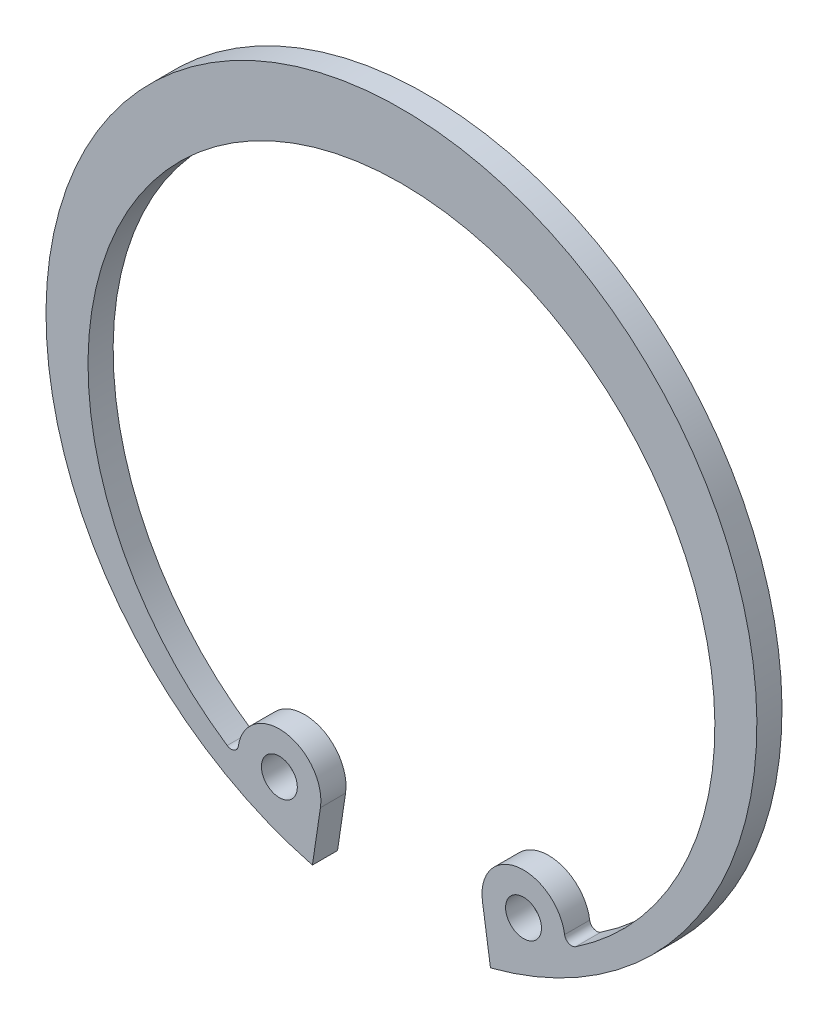
ISO-10303-21;
HEADER;
FILE_DESCRIPTION(('STEP AP214'),'2;1');
FILE_NAME('part.step','',(''),(''),'','','');
FILE_SCHEMA(('AUTOMOTIVE_DESIGN { 1 0 10303 214 1 1 1 1 }'));
ENDSEC;
DATA;
#1=APPLICATION_CONTEXT('core data for automotive mechanical design processes');
#2=APPLICATION_PROTOCOL_DEFINITION('international standard','automotive_design',2000,#1);
#3=PRODUCT_CONTEXT('',#1,'mechanical');
#4=PRODUCT('Part','Part','',(#3));
#5=PRODUCT_RELATED_PRODUCT_CATEGORY('part','',(#4));
#6=PRODUCT_DEFINITION_FORMATION('','',#4);
#7=PRODUCT_DEFINITION_CONTEXT('part definition',#1,'design');
#8=PRODUCT_DEFINITION('design','',#6,#7);
#9=PRODUCT_DEFINITION_SHAPE('','',#8);
#10=(LENGTH_UNIT() NAMED_UNIT(*) SI_UNIT(.MILLI.,.METRE.));
#11=(NAMED_UNIT(*) PLANE_ANGLE_UNIT() SI_UNIT($,.RADIAN.));
#12=(NAMED_UNIT(*) SI_UNIT($,.STERADIAN.) SOLID_ANGLE_UNIT());
#13=UNCERTAINTY_MEASURE_WITH_UNIT(LENGTH_MEASURE(1.E-05),#10,'distance_accuracy_value','');
#14=(GEOMETRIC_REPRESENTATION_CONTEXT(3) GLOBAL_UNCERTAINTY_ASSIGNED_CONTEXT((#13)) GLOBAL_UNIT_ASSIGNED_CONTEXT((#10,
#11,#12)) REPRESENTATION_CONTEXT('',''));
#15=CARTESIAN_POINT('',(0.,0.,0.));
#16=DIRECTION('',(0.,0.,1.));
#17=DIRECTION('',(1.,0.,0.));
#18=AXIS2_PLACEMENT_3D('',#15,#16,#17);
#19=CARTESIAN_POINT('',(-8.5,-19.7928377926956,1.75));
#20=DIRECTION('',(0.,0.,1.));
#21=DIRECTION('',(1.,0.,0.));
#22=AXIS2_PLACEMENT_3D('',#19,#20,#21);
#23=PLANE('',#22);
#24=CARTESIAN_POINT('',(-8.5,-19.7928377926956,1.75));
#25=DIRECTION('',(0.,0.,1.));
#26=DIRECTION('',(1.,0.,0.));
#27=AXIS2_PLACEMENT_3D('',#24,#25,#26);
#28=CIRCLE('',#27,1.25);
#29=CARTESIAN_POINT('',(-7.25,-19.7928377926956,1.75));
#30=VERTEX_POINT('',#29);
#31=EDGE_CURVE('E134',#30,#30,#28,.T.);
#32=ORIENTED_EDGE('',*,*,#31,.F.);
#33=EDGE_LOOP('',(#32));
#34=FACE_BOUND('',#33,.T.);
#35=CARTESIAN_POINT('',(-8.5,-19.7928377926956,1.75));
#36=DIRECTION('',(0.,0.,1.));
#37=DIRECTION('',(1.,0.,0.));
#38=AXIS2_PLACEMENT_3D('',#35,#36,#37);
#39=CIRCLE('',#38,2.89080843162481);
#40=CARTESIAN_POINT('',(-5.64094460318268,-20.2201264846626,1.75));
#41=VERTEX_POINT('',#40);
#42=CARTESIAN_POINT('',(-11.3602513121852,-19.3736292294532,1.75));
#43=VERTEX_POINT('',#42);
#44=EDGE_CURVE('E145',#41,#43,#39,.T.);
#45=ORIENTED_EDGE('',*,*,#44,.T.);
#46=CARTESIAN_POINT('',(-11.8549660917768,-19.3011220790906,1.75));
#47=DIRECTION('',(0.,0.,-1.));
#48=DIRECTION('',(1.,0.,0.));
#49=AXIS2_PLACEMENT_3D('',#46,#47,#48);
#50=CIRCLE('',#49,0.500000000000003);
#51=CARTESIAN_POINT('',(-12.1329254374222,-19.7167404162322,1.75));
#52=VERTEX_POINT('',#51);
#53=EDGE_CURVE('E93',#43,#52,#50,.T.);
#54=ORIENTED_EDGE('',*,*,#53,.T.);
#55=CARTESIAN_POINT('',(0.,-1.575,1.75));
#56=DIRECTION('',(0.,0.,-1.));
#57=DIRECTION('',(1.,0.,0.));
#58=AXIS2_PLACEMENT_3D('',#55,#56,#57);
#59=CIRCLE('',#58,21.825);
#60=CARTESIAN_POINT('',(12.1329254374222,-19.7167404162322,1.75));
#61=VERTEX_POINT('',#60);
#62=EDGE_CURVE('E160',#52,#61,#59,.T.);
#63=ORIENTED_EDGE('',*,*,#62,.T.);
#64=CARTESIAN_POINT('',(11.8549660917768,-19.3011220790906,1.75));
#65=DIRECTION('',(0.,0.,-1.));
#66=DIRECTION('',(-1.,0.,0.));
#67=AXIS2_PLACEMENT_3D('',#64,#65,#66);
#68=CIRCLE('',#67,0.500000000000003);
#69=CARTESIAN_POINT('',(11.3602513121852,-19.3736292294532,1.75));
#70=VERTEX_POINT('',#69);
#71=EDGE_CURVE('E173',#61,#70,#68,.T.);
#72=ORIENTED_EDGE('',*,*,#71,.T.);
#73=CARTESIAN_POINT('',(8.5,-19.7928377926956,1.75));
#74=DIRECTION('',(0.,0.,1.));
#75=DIRECTION('',(1.,0.,0.));
#76=AXIS2_PLACEMENT_3D('',#73,#74,#75);
#77=CIRCLE('',#76,2.89080843162481);
#78=CARTESIAN_POINT('',(5.64094460318268,-20.2201264846626,1.75));
#79=VERTEX_POINT('',#78);
#80=EDGE_CURVE('E112',#70,#79,#77,.T.);
#81=ORIENTED_EDGE('',*,*,#80,.T.);
#82=DIRECTION('',(0.147809411129611,-0.989015863361917,0.));
#83=VECTOR('',#82,1.);
#84=CARTESIAN_POINT('',(5.64094460318268,-20.2201264846626,1.75));
#85=LINE('',#84,#83);
#86=CARTESIAN_POINT('',(6.19999999999999,-23.9608534906418,1.75));
#87=VERTEX_POINT('',#86);
#88=EDGE_CURVE('E106',#79,#87,#85,.T.);
#89=ORIENTED_EDGE('',*,*,#88,.T.);
#90=CARTESIAN_POINT('',(0.,0.,1.75));
#91=DIRECTION('',(0.,0.,1.));
#92=DIRECTION('',(1.,0.,0.));
#93=AXIS2_PLACEMENT_3D('',#90,#91,#92);
#94=CIRCLE('',#93,24.75);
#95=CARTESIAN_POINT('',(-6.2,-23.9608534906418,1.75));
#96=VERTEX_POINT('',#95);
#97=EDGE_CURVE('E110',#87,#96,#94,.T.);
#98=ORIENTED_EDGE('',*,*,#97,.T.);
#99=DIRECTION('',(0.147809411129611,0.989015863361917,0.));
#100=VECTOR('',#99,1.);
#101=CARTESIAN_POINT('',(-5.64094460318268,-20.2201264846626,1.75));
#102=LINE('',#101,#100);
#103=EDGE_CURVE('E50',#96,#41,#102,.T.);
#104=ORIENTED_EDGE('',*,*,#103,.T.);
#105=EDGE_LOOP('',(#45,#54,#63,#72,#81,#89,#98,#104));
#106=FACE_BOUND('',#105,.T.);
#107=CARTESIAN_POINT('',(8.5,-19.7928377926956,1.75));
#108=DIRECTION('',(0.,0.,1.));
#109=DIRECTION('',(1.,0.,0.));
#110=AXIS2_PLACEMENT_3D('',#107,#108,#109);
#111=CIRCLE('',#110,1.25);
#112=CARTESIAN_POINT('',(9.75,-19.7928377926956,1.75));
#113=VERTEX_POINT('',#112);
#114=EDGE_CURVE('E182',#113,#113,#111,.T.);
#115=ORIENTED_EDGE('',*,*,#114,.F.);
#116=EDGE_LOOP('',(#115));
#117=FACE_BOUND('',#116,.T.);
#118=ADVANCED_FACE('F33',(#34,#106,#117),#23,.T.);
#119=CARTESIAN_POINT('',(-8.5,-19.7928377926956,0.));
#120=DIRECTION('',(0.,0.,1.));
#121=DIRECTION('',(1.,0.,0.));
#122=AXIS2_PLACEMENT_3D('',#119,#120,#121);
#123=PLANE('',#122);
#124=CARTESIAN_POINT('',(-8.5,-19.7928377926956,0.));
#125=DIRECTION('',(0.,0.,1.));
#126=DIRECTION('',(1.,0.,0.));
#127=AXIS2_PLACEMENT_3D('',#124,#125,#126);
#128=CIRCLE('',#127,2.89080843162481);
#129=CARTESIAN_POINT('',(-5.64094460318268,-20.2201264846626,0.));
#130=VERTEX_POINT('',#129);
#131=CARTESIAN_POINT('',(-11.3602513121852,-19.3736292294532,0.));
#132=VERTEX_POINT('',#131);
#133=EDGE_CURVE('E130',#130,#132,#128,.T.);
#134=ORIENTED_EDGE('',*,*,#133,.F.);
#135=DIRECTION('',(0.147809411129611,0.989015863361917,0.));
#136=VECTOR('',#135,1.);
#137=CARTESIAN_POINT('',(-5.64094460318268,-20.2201264846626,0.));
#138=LINE('',#137,#136);
#139=CARTESIAN_POINT('',(-6.2,-23.9608534906418,0.));
#140=VERTEX_POINT('',#139);
#141=EDGE_CURVE('E85',#140,#130,#138,.T.);
#142=ORIENTED_EDGE('',*,*,#141,.F.);
#143=CARTESIAN_POINT('',(0.,0.,0.));
#144=DIRECTION('',(0.,0.,1.));
#145=DIRECTION('',(1.,0.,0.));
#146=AXIS2_PLACEMENT_3D('',#143,#144,#145);
#147=CIRCLE('',#146,24.75);
#148=CARTESIAN_POINT('',(6.19999999999999,-23.9608534906418,0.));
#149=VERTEX_POINT('',#148);
#150=EDGE_CURVE('E79',#149,#140,#147,.T.);
#151=ORIENTED_EDGE('',*,*,#150,.F.);
#152=DIRECTION('',(0.147809411129611,-0.989015863361917,0.));
#153=VECTOR('',#152,1.);
#154=CARTESIAN_POINT('',(5.64094460318268,-20.2201264846626,0.));
#155=LINE('',#154,#153);
#156=CARTESIAN_POINT('',(5.64094460318268,-20.2201264846626,0.));
#157=VERTEX_POINT('',#156);
#158=EDGE_CURVE('E120',#157,#149,#155,.T.);
#159=ORIENTED_EDGE('',*,*,#158,.F.);
#160=CARTESIAN_POINT('',(8.5,-19.7928377926956,0.));
#161=DIRECTION('',(0.,0.,1.));
#162=DIRECTION('',(1.,0.,0.));
#163=AXIS2_PLACEMENT_3D('',#160,#161,#162);
#164=CIRCLE('',#163,2.89080843162481);
#165=CARTESIAN_POINT('',(11.3602513121852,-19.3736292294532,0.));
#166=VERTEX_POINT('',#165);
#167=EDGE_CURVE('E140',#166,#157,#164,.T.);
#168=ORIENTED_EDGE('',*,*,#167,.F.);
#169=CARTESIAN_POINT('',(11.8549660917768,-19.3011220790906,0.));
#170=DIRECTION('',(0.,0.,-1.));
#171=DIRECTION('',(-1.,0.,0.));
#172=AXIS2_PLACEMENT_3D('',#169,#170,#171);
#173=CIRCLE('',#172,0.500000000000003);
#174=CARTESIAN_POINT('',(12.1329254374222,-19.7167404162322,0.));
#175=VERTEX_POINT('',#174);
#176=EDGE_CURVE('E138',#175,#166,#173,.T.);
#177=ORIENTED_EDGE('',*,*,#176,.F.);
#178=CARTESIAN_POINT('',(0.,-1.575,0.));
#179=DIRECTION('',(0.,0.,-1.));
#180=DIRECTION('',(1.,0.,0.));
#181=AXIS2_PLACEMENT_3D('',#178,#179,#180);
#182=CIRCLE('',#181,21.825);
#183=CARTESIAN_POINT('',(-12.1329254374222,-19.7167404162322,0.));
#184=VERTEX_POINT('',#183);
#185=EDGE_CURVE('E136',#184,#175,#182,.T.);
#186=ORIENTED_EDGE('',*,*,#185,.F.);
#187=CARTESIAN_POINT('',(-11.8549660917768,-19.3011220790906,0.));
#188=DIRECTION('',(0.,0.,-1.));
#189=DIRECTION('',(1.,0.,0.));
#190=AXIS2_PLACEMENT_3D('',#187,#188,#189);
#191=CIRCLE('',#190,0.500000000000003);
#192=EDGE_CURVE('E133',#132,#184,#191,.T.);
#193=ORIENTED_EDGE('',*,*,#192,.F.);
#194=EDGE_LOOP('',(#134,#142,#151,#159,#168,#177,#186,#193));
#195=FACE_BOUND('',#194,.T.);
#196=CARTESIAN_POINT('',(-8.5,-19.7928377926956,0.));
#197=DIRECTION('',(0.,0.,1.));
#198=DIRECTION('',(1.,0.,0.));
#199=AXIS2_PLACEMENT_3D('',#196,#197,#198);
#200=CIRCLE('',#199,1.25);
#201=CARTESIAN_POINT('',(-7.25,-19.7928377926956,0.));
#202=VERTEX_POINT('',#201);
#203=EDGE_CURVE('E179',#202,#202,#200,.T.);
#204=ORIENTED_EDGE('',*,*,#203,.T.);
#205=EDGE_LOOP('',(#204));
#206=FACE_BOUND('',#205,.T.);
#207=CARTESIAN_POINT('',(8.5,-19.7928377926956,0.));
#208=DIRECTION('',(0.,0.,1.));
#209=DIRECTION('',(1.,0.,0.));
#210=AXIS2_PLACEMENT_3D('',#207,#208,#209);
#211=CIRCLE('',#210,1.25);
#212=CARTESIAN_POINT('',(9.75,-19.7928377926956,0.));
#213=VERTEX_POINT('',#212);
#214=EDGE_CURVE('E185',#213,#213,#211,.T.);
#215=ORIENTED_EDGE('',*,*,#214,.T.);
#216=EDGE_LOOP('',(#215));
#217=FACE_BOUND('',#216,.T.);
#218=ADVANCED_FACE('F164',(#195,#206,#217),#123,.F.);
#219=CARTESIAN_POINT('',(-8.5,-19.7928377926956,1.75));
#220=DIRECTION('',(0.,0.,-1.));
#221=DIRECTION('',(-1.,0.,0.));
#222=AXIS2_PLACEMENT_3D('',#219,#220,#221);
#223=CYLINDRICAL_SURFACE('',#222,2.89080843162481);
#224=ORIENTED_EDGE('',*,*,#133,.T.);
#225=DIRECTION('',(0.,0.,-1.));
#226=VECTOR('',#225,1.);
#227=CARTESIAN_POINT('',(-11.3602513121852,-19.3736292294532,1.75));
#228=LINE('',#227,#226);
#229=EDGE_CURVE('E11',#43,#132,#228,.T.);
#230=ORIENTED_EDGE('',*,*,#229,.F.);
#231=ORIENTED_EDGE('',*,*,#44,.F.);
#232=DIRECTION('',(0.,0.,-1.));
#233=VECTOR('',#232,1.);
#234=CARTESIAN_POINT('',(-5.64094460318268,-20.2201264846626,1.75));
#235=LINE('',#234,#233);
#236=EDGE_CURVE('E126',#41,#130,#235,.T.);
#237=ORIENTED_EDGE('',*,*,#236,.T.);
#238=EDGE_LOOP('',(#224,#230,#231,#237));
#239=FACE_BOUND('',#238,.T.);
#240=ADVANCED_FACE('F35',(#239),#223,.T.);
#241=CARTESIAN_POINT('',(-11.8549660917768,-19.3011220790906,1.75));
#242=DIRECTION('',(0.,0.,-1.));
#243=DIRECTION('',(-1.,0.,0.));
#244=AXIS2_PLACEMENT_3D('',#241,#242,#243);
#245=CYLINDRICAL_SURFACE('',#244,0.500000000000003);
#246=ORIENTED_EDGE('',*,*,#192,.T.);
#247=DIRECTION('',(0.,0.,-1.));
#248=VECTOR('',#247,1.);
#249=CARTESIAN_POINT('',(-12.1329254374222,-19.7167404162322,1.75));
#250=LINE('',#249,#248);
#251=EDGE_CURVE('E42',#52,#184,#250,.T.);
#252=ORIENTED_EDGE('',*,*,#251,.F.);
#253=ORIENTED_EDGE('',*,*,#53,.F.);
#254=ORIENTED_EDGE('',*,*,#229,.T.);
#255=EDGE_LOOP('',(#246,#252,#253,#254));
#256=FACE_BOUND('',#255,.T.);
#257=ADVANCED_FACE('F217',(#256),#245,.F.);
#258=CARTESIAN_POINT('',(0.,-1.575,1.75));
#259=DIRECTION('',(0.,0.,-1.));
#260=DIRECTION('',(-1.,0.,0.));
#261=AXIS2_PLACEMENT_3D('',#258,#259,#260);
#262=CYLINDRICAL_SURFACE('',#261,21.825);
#263=ORIENTED_EDGE('',*,*,#185,.T.);
#264=DIRECTION('',(0.,0.,-1.));
#265=VECTOR('',#264,1.);
#266=CARTESIAN_POINT('',(12.1329254374222,-19.7167404162322,1.75));
#267=LINE('',#266,#265);
#268=EDGE_CURVE('E152',#61,#175,#267,.T.);
#269=ORIENTED_EDGE('',*,*,#268,.F.);
#270=ORIENTED_EDGE('',*,*,#62,.F.);
#271=ORIENTED_EDGE('',*,*,#251,.T.);
#272=EDGE_LOOP('',(#263,#269,#270,#271));
#273=FACE_BOUND('',#272,.T.);
#274=ADVANCED_FACE('F158',(#273),#262,.F.);
#275=CARTESIAN_POINT('',(11.8549660917768,-19.3011220790906,1.75));
#276=DIRECTION('',(0.,0.,-1.));
#277=DIRECTION('',(-1.,0.,0.));
#278=AXIS2_PLACEMENT_3D('',#275,#276,#277);
#279=CYLINDRICAL_SURFACE('',#278,0.500000000000003);
#280=ORIENTED_EDGE('',*,*,#176,.T.);
#281=DIRECTION('',(0.,0.,-1.));
#282=VECTOR('',#281,1.);
#283=CARTESIAN_POINT('',(11.3602513121852,-19.3736292294532,1.75));
#284=LINE('',#283,#282);
#285=EDGE_CURVE('E149',#70,#166,#284,.T.);
#286=ORIENTED_EDGE('',*,*,#285,.F.);
#287=ORIENTED_EDGE('',*,*,#71,.F.);
#288=ORIENTED_EDGE('',*,*,#268,.T.);
#289=EDGE_LOOP('',(#280,#286,#287,#288));
#290=FACE_BOUND('',#289,.T.);
#291=ADVANCED_FACE('F169',(#290),#279,.F.);
#292=CARTESIAN_POINT('',(8.5,-19.7928377926956,1.75));
#293=DIRECTION('',(0.,0.,-1.));
#294=DIRECTION('',(-1.,0.,0.));
#295=AXIS2_PLACEMENT_3D('',#292,#293,#294);
#296=CYLINDRICAL_SURFACE('',#295,2.89080843162481);
#297=ORIENTED_EDGE('',*,*,#167,.T.);
#298=DIRECTION('',(0.,0.,-1.));
#299=VECTOR('',#298,1.);
#300=CARTESIAN_POINT('',(5.64094460318268,-20.2201264846626,1.75));
#301=LINE('',#300,#299);
#302=EDGE_CURVE('E121',#79,#157,#301,.T.);
#303=ORIENTED_EDGE('',*,*,#302,.F.);
#304=ORIENTED_EDGE('',*,*,#80,.F.);
#305=ORIENTED_EDGE('',*,*,#285,.T.);
#306=EDGE_LOOP('',(#297,#303,#304,#305));
#307=FACE_BOUND('',#306,.T.);
#308=ADVANCED_FACE('F172',(#307),#296,.T.);
#309=CARTESIAN_POINT('',(5.64094460318268,-20.2201264846626,1.75));
#310=DIRECTION('',(0.989015863361917,0.147809411129611,0.));
#311=DIRECTION('',(-0.147809411129611,0.989015863361917,0.));
#312=AXIS2_PLACEMENT_3D('',#309,#310,#311);
#313=PLANE('',#312);
#314=ORIENTED_EDGE('',*,*,#158,.T.);
#315=DIRECTION('',(0.,0.,-1.));
#316=VECTOR('',#315,1.);
#317=CARTESIAN_POINT('',(6.19999999999999,-23.9608534906418,1.75));
#318=LINE('',#317,#316);
#319=EDGE_CURVE('E117',#87,#149,#318,.T.);
#320=ORIENTED_EDGE('',*,*,#319,.F.);
#321=ORIENTED_EDGE('',*,*,#88,.F.);
#322=ORIENTED_EDGE('',*,*,#302,.T.);
#323=EDGE_LOOP('',(#314,#320,#321,#322));
#324=FACE_BOUND('',#323,.T.);
#325=ADVANCED_FACE('F118',(#324),#313,.F.);
#326=CARTESIAN_POINT('',(0.,0.,1.75));
#327=DIRECTION('',(0.,0.,-1.));
#328=DIRECTION('',(-1.,0.,0.));
#329=AXIS2_PLACEMENT_3D('',#326,#327,#328);
#330=CYLINDRICAL_SURFACE('',#329,24.75);
#331=ORIENTED_EDGE('',*,*,#150,.T.);
#332=DIRECTION('',(0.,0.,-1.));
#333=VECTOR('',#332,1.);
#334=CARTESIAN_POINT('',(-6.2,-23.9608534906418,1.75));
#335=LINE('',#334,#333);
#336=EDGE_CURVE('E122',#96,#140,#335,.T.);
#337=ORIENTED_EDGE('',*,*,#336,.F.);
#338=ORIENTED_EDGE('',*,*,#97,.F.);
#339=ORIENTED_EDGE('',*,*,#319,.T.);
#340=EDGE_LOOP('',(#331,#337,#338,#339));
#341=FACE_BOUND('',#340,.T.);
#342=ADVANCED_FACE('F124',(#341),#330,.T.);
#343=CARTESIAN_POINT('',(-5.64094460318268,-20.2201264846626,1.75));
#344=DIRECTION('',(-0.989015863361917,0.147809411129611,0.));
#345=DIRECTION('',(-0.147809411129611,-0.989015863361917,0.));
#346=AXIS2_PLACEMENT_3D('',#343,#344,#345);
#347=PLANE('',#346);
#348=ORIENTED_EDGE('',*,*,#141,.T.);
#349=ORIENTED_EDGE('',*,*,#236,.F.);
#350=ORIENTED_EDGE('',*,*,#103,.F.);
#351=ORIENTED_EDGE('',*,*,#336,.T.);
#352=EDGE_LOOP('',(#348,#349,#350,#351));
#353=FACE_BOUND('',#352,.T.);
#354=ADVANCED_FACE('F205',(#353),#347,.F.);
#355=CARTESIAN_POINT('',(-8.5,-19.7928377926956,1.75));
#356=DIRECTION('',(0.,0.,-1.));
#357=DIRECTION('',(-1.,0.,0.));
#358=AXIS2_PLACEMENT_3D('',#355,#356,#357);
#359=CYLINDRICAL_SURFACE('',#358,1.25);
#360=ORIENTED_EDGE('',*,*,#31,.T.);
#361=EDGE_LOOP('',(#360));
#362=FACE_BOUND('',#361,.T.);
#363=ORIENTED_EDGE('',*,*,#203,.F.);
#364=EDGE_LOOP('',(#363));
#365=FACE_BOUND('',#364,.T.);
#366=ADVANCED_FACE('F202',(#362,#365),#359,.F.);
#367=CARTESIAN_POINT('',(8.5,-19.7928377926956,1.75));
#368=DIRECTION('',(0.,0.,-1.));
#369=DIRECTION('',(-1.,0.,0.));
#370=AXIS2_PLACEMENT_3D('',#367,#368,#369);
#371=CYLINDRICAL_SURFACE('',#370,1.25);
#372=ORIENTED_EDGE('',*,*,#114,.T.);
#373=EDGE_LOOP('',(#372));
#374=FACE_BOUND('',#373,.T.);
#375=ORIENTED_EDGE('',*,*,#214,.F.);
#376=EDGE_LOOP('',(#375));
#377=FACE_BOUND('',#376,.T.);
#378=ADVANCED_FACE('F191',(#374,#377),#371,.F.);
#379=CLOSED_SHELL('',(#118,#218,#240,#257,#274,#291,#308,#325,#342,#354,#366,#378));
#380=MANIFOLD_SOLID_BREP('B2',#379);
#381=ADVANCED_BREP_SHAPE_REPRESENTATION('',(#18,#380),#14);
#382=SHAPE_DEFINITION_REPRESENTATION(#9,#381);
ENDSEC;
END-ISO-10303-21;
